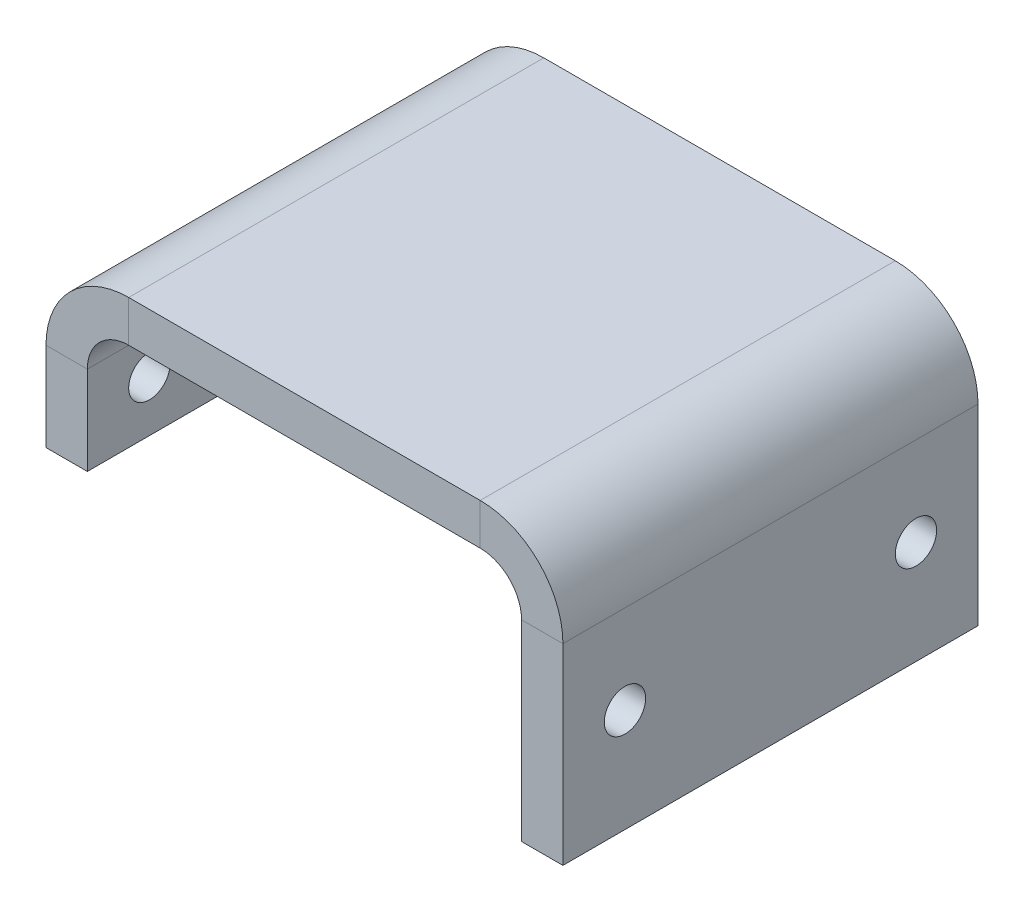
ISO-10303-21;
HEADER;
FILE_DESCRIPTION(('STEP AP214'),'2;1');
FILE_NAME('part.step','',(''),(''),'','','');
FILE_SCHEMA(('AUTOMOTIVE_DESIGN { 1 0 10303 214 1 1 1 1 }'));
ENDSEC;
DATA;
#1=APPLICATION_CONTEXT('core data for automotive mechanical design processes');
#2=APPLICATION_PROTOCOL_DEFINITION('international standard','automotive_design',2000,#1);
#3=PRODUCT_CONTEXT('',#1,'mechanical');
#4=PRODUCT('Part','Part','',(#3));
#5=PRODUCT_RELATED_PRODUCT_CATEGORY('part','',(#4));
#6=PRODUCT_DEFINITION_FORMATION('','',#4);
#7=PRODUCT_DEFINITION_CONTEXT('part definition',#1,'design');
#8=PRODUCT_DEFINITION('design','',#6,#7);
#9=PRODUCT_DEFINITION_SHAPE('','',#8);
#10=(LENGTH_UNIT() NAMED_UNIT(*) SI_UNIT(.MILLI.,.METRE.));
#11=(NAMED_UNIT(*) PLANE_ANGLE_UNIT() SI_UNIT($,.RADIAN.));
#12=(NAMED_UNIT(*) SI_UNIT($,.STERADIAN.) SOLID_ANGLE_UNIT());
#13=UNCERTAINTY_MEASURE_WITH_UNIT(LENGTH_MEASURE(1.E-05),#10,'distance_accuracy_value','');
#14=(GEOMETRIC_REPRESENTATION_CONTEXT(3) GLOBAL_UNCERTAINTY_ASSIGNED_CONTEXT((#13)) GLOBAL_UNIT_ASSIGNED_CONTEXT((#10,
#11,#12)) REPRESENTATION_CONTEXT('',''));
#15=CARTESIAN_POINT('',(0.,0.,0.));
#16=DIRECTION('',(0.,0.,1.));
#17=DIRECTION('',(1.,0.,0.));
#18=AXIS2_PLACEMENT_3D('',#15,#16,#17);
#19=CARTESIAN_POINT('',(-40.,-4.,20.075));
#20=DIRECTION('',(0.,0.,1.));
#21=DIRECTION('',(1.,0.,0.));
#22=AXIS2_PLACEMENT_3D('',#19,#20,#21);
#23=PLANE('',#22);
#24=DIRECTION('',(1.,0.,0.));
#25=VECTOR('',#24,1.);
#26=CARTESIAN_POINT('',(-40.,-4.,20.075));
#27=LINE('',#26,#25);
#28=CARTESIAN_POINT('',(-22.,-4.,20.075));
#29=VERTEX_POINT('',#28);
#30=CARTESIAN_POINT('',(12.,-4.,20.075));
#31=VERTEX_POINT('',#30);
#32=EDGE_CURVE('E219',#29,#31,#27,.T.);
#33=ORIENTED_EDGE('',*,*,#32,.T.);
#34=DIRECTION('',(0.,1.,0.));
#35=VECTOR('',#34,1.);
#36=CARTESIAN_POINT('',(12.,-4.,20.075));
#37=LINE('',#36,#35);
#38=CARTESIAN_POINT('',(12.,0.,20.075));
#39=VERTEX_POINT('',#38);
#40=EDGE_CURVE('E12',#31,#39,#37,.T.);
#41=ORIENTED_EDGE('',*,*,#40,.T.);
#42=DIRECTION('',(1.,0.,0.));
#43=VECTOR('',#42,1.);
#44=CARTESIAN_POINT('',(-40.,0.,20.075));
#45=LINE('',#44,#43);
#46=CARTESIAN_POINT('',(-22.,0.,20.075));
#47=VERTEX_POINT('',#46);
#48=EDGE_CURVE('E203',#47,#39,#45,.T.);
#49=ORIENTED_EDGE('',*,*,#48,.F.);
#50=DIRECTION('',(0.,1.,0.));
#51=VECTOR('',#50,1.);
#52=CARTESIAN_POINT('',(-22.,-4.,20.075));
#53=LINE('',#52,#51);
#54=EDGE_CURVE('E208',#29,#47,#53,.T.);
#55=ORIENTED_EDGE('',*,*,#54,.F.);
#56=EDGE_LOOP('',(#33,#41,#49,#55));
#57=FACE_BOUND('',#56,.T.);
#58=ADVANCED_FACE('F45',(#57),#23,.T.);
#59=CARTESIAN_POINT('',(-40.,-4.,-20.075));
#60=DIRECTION('',(0.,0.,-1.));
#61=DIRECTION('',(-1.,0.,0.));
#62=AXIS2_PLACEMENT_3D('',#59,#60,#61);
#63=PLANE('',#62);
#64=DIRECTION('',(-1.,0.,0.));
#65=VECTOR('',#64,1.);
#66=CARTESIAN_POINT('',(-40.,0.,-20.075));
#67=LINE('',#66,#65);
#68=CARTESIAN_POINT('',(12.,0.,-20.075));
#69=VERTEX_POINT('',#68);
#70=CARTESIAN_POINT('',(-22.,0.,-20.075));
#71=VERTEX_POINT('',#70);
#72=EDGE_CURVE('E204',#69,#71,#67,.T.);
#73=ORIENTED_EDGE('',*,*,#72,.F.);
#74=DIRECTION('',(0.,-1.,0.));
#75=VECTOR('',#74,1.);
#76=CARTESIAN_POINT('',(12.,-4.,-20.075));
#77=LINE('',#76,#75);
#78=CARTESIAN_POINT('',(12.,-4.,-20.075));
#79=VERTEX_POINT('',#78);
#80=EDGE_CURVE('E260',#69,#79,#77,.T.);
#81=ORIENTED_EDGE('',*,*,#80,.T.);
#82=DIRECTION('',(-1.,0.,0.));
#83=VECTOR('',#82,1.);
#84=CARTESIAN_POINT('',(-40.,-4.,-20.075));
#85=LINE('',#84,#83);
#86=CARTESIAN_POINT('',(-22.,-4.,-20.075));
#87=VERTEX_POINT('',#86);
#88=EDGE_CURVE('E48',#79,#87,#85,.T.);
#89=ORIENTED_EDGE('',*,*,#88,.T.);
#90=DIRECTION('',(0.,-1.,0.));
#91=VECTOR('',#90,1.);
#92=CARTESIAN_POINT('',(-22.,-4.,-20.075));
#93=LINE('',#92,#91);
#94=EDGE_CURVE('E205',#71,#87,#93,.T.);
#95=ORIENTED_EDGE('',*,*,#94,.F.);
#96=EDGE_LOOP('',(#73,#81,#89,#95));
#97=FACE_BOUND('',#96,.T.);
#98=ADVANCED_FACE('F273',(#97),#63,.T.);
#99=CARTESIAN_POINT('',(0.,-4.,0.));
#100=DIRECTION('',(0.,-1.,0.));
#101=DIRECTION('',(0.,0.,-1.));
#102=AXIS2_PLACEMENT_3D('',#99,#100,#101);
#103=PLANE('',#102);
#104=ORIENTED_EDGE('',*,*,#88,.F.);
#105=DIRECTION('',(0.,0.,1.));
#106=VECTOR('',#105,1.);
#107=CARTESIAN_POINT('',(12.,-4.,0.));
#108=LINE('',#107,#106);
#109=EDGE_CURVE('E251',#79,#31,#108,.T.);
#110=ORIENTED_EDGE('',*,*,#109,.T.);
#111=ORIENTED_EDGE('',*,*,#32,.F.);
#112=DIRECTION('',(0.,0.,1.));
#113=VECTOR('',#112,1.);
#114=CARTESIAN_POINT('',(-22.,-4.,0.));
#115=LINE('',#114,#113);
#116=EDGE_CURVE('E195',#87,#29,#115,.T.);
#117=ORIENTED_EDGE('',*,*,#116,.F.);
#118=EDGE_LOOP('',(#104,#110,#111,#117));
#119=FACE_BOUND('',#118,.T.);
#120=ADVANCED_FACE('F276',(#119),#103,.T.);
#121=CARTESIAN_POINT('',(-26.,-16.5752220392306,20.075));
#122=DIRECTION('',(0.,0.,1.));
#123=DIRECTION('',(0.,1.,0.));
#124=AXIS2_PLACEMENT_3D('',#121,#122,#123);
#125=PLANE('',#124);
#126=DIRECTION('',(0.,1.,0.));
#127=VECTOR('',#126,1.);
#128=CARTESIAN_POINT('',(-26.,-16.5752220392306,20.075));
#129=LINE('',#128,#127);
#130=CARTESIAN_POINT('',(-26.,-16.5752220392306,20.075));
#131=VERTEX_POINT('',#130);
#132=CARTESIAN_POINT('',(-26.,-8.00000000000001,20.075));
#133=VERTEX_POINT('',#132);
#134=EDGE_CURVE('E229',#131,#133,#129,.T.);
#135=ORIENTED_EDGE('',*,*,#134,.T.);
#136=DIRECTION('',(-1.,0.,0.));
#137=VECTOR('',#136,1.);
#138=CARTESIAN_POINT('',(-26.,-8.00000000000001,20.075));
#139=LINE('',#138,#137);
#140=CARTESIAN_POINT('',(-30.,-8.00000000000004,20.075));
#141=VERTEX_POINT('',#140);
#142=EDGE_CURVE('E248',#133,#141,#139,.T.);
#143=ORIENTED_EDGE('',*,*,#142,.T.);
#144=DIRECTION('',(0.,1.,0.));
#145=VECTOR('',#144,1.);
#146=CARTESIAN_POINT('',(-30.,-16.5752220392306,20.075));
#147=LINE('',#146,#145);
#148=CARTESIAN_POINT('',(-30.,-16.5752220392306,20.075));
#149=VERTEX_POINT('',#148);
#150=EDGE_CURVE('E234',#149,#141,#147,.T.);
#151=ORIENTED_EDGE('',*,*,#150,.F.);
#152=DIRECTION('',(-1.,0.,0.));
#153=VECTOR('',#152,1.);
#154=CARTESIAN_POINT('',(-26.,-16.5752220392306,20.075));
#155=LINE('',#154,#153);
#156=EDGE_CURVE('E235',#131,#149,#155,.T.);
#157=ORIENTED_EDGE('',*,*,#156,.F.);
#158=EDGE_LOOP('',(#135,#143,#151,#157));
#159=FACE_BOUND('',#158,.T.);
#160=ADVANCED_FACE('F289',(#159),#125,.T.);
#161=CARTESIAN_POINT('',(-26.,-16.5752220392306,-20.075));
#162=DIRECTION('',(0.,0.,-1.));
#163=DIRECTION('',(0.,-1.,0.));
#164=AXIS2_PLACEMENT_3D('',#161,#162,#163);
#165=PLANE('',#164);
#166=DIRECTION('',(0.,-1.,0.));
#167=VECTOR('',#166,1.);
#168=CARTESIAN_POINT('',(-30.,-16.5752220392306,-20.075));
#169=LINE('',#168,#167);
#170=CARTESIAN_POINT('',(-30.,-8.00000000000004,-20.075));
#171=VERTEX_POINT('',#170);
#172=CARTESIAN_POINT('',(-30.,-16.5752220392306,-20.075));
#173=VERTEX_POINT('',#172);
#174=EDGE_CURVE('E223',#171,#173,#169,.T.);
#175=ORIENTED_EDGE('',*,*,#174,.F.);
#176=DIRECTION('',(1.,0.,0.));
#177=VECTOR('',#176,1.);
#178=CARTESIAN_POINT('',(-26.,-8.00000000000001,-20.075));
#179=LINE('',#178,#177);
#180=CARTESIAN_POINT('',(-26.,-8.00000000000002,-20.075));
#181=VERTEX_POINT('',#180);
#182=EDGE_CURVE('E243',#171,#181,#179,.T.);
#183=ORIENTED_EDGE('',*,*,#182,.T.);
#184=DIRECTION('',(0.,-1.,0.));
#185=VECTOR('',#184,1.);
#186=CARTESIAN_POINT('',(-26.,-16.5752220392306,-20.075));
#187=LINE('',#186,#185);
#188=CARTESIAN_POINT('',(-26.,-16.5752220392306,-20.075));
#189=VERTEX_POINT('',#188);
#190=EDGE_CURVE('E230',#181,#189,#187,.T.);
#191=ORIENTED_EDGE('',*,*,#190,.T.);
#192=DIRECTION('',(-1.,0.,0.));
#193=VECTOR('',#192,1.);
#194=CARTESIAN_POINT('',(-26.,-16.5752220392306,-20.075));
#195=LINE('',#194,#193);
#196=EDGE_CURVE('E238',#189,#173,#195,.T.);
#197=ORIENTED_EDGE('',*,*,#196,.T.);
#198=EDGE_LOOP('',(#175,#183,#191,#197));
#199=FACE_BOUND('',#198,.T.);
#200=ADVANCED_FACE('F297',(#199),#165,.T.);
#201=CARTESIAN_POINT('',(-26.0000000000001,23.4247779607694,0.));
#202=DIRECTION('',(1.,0.,0.));
#203=DIRECTION('',(0.,0.,-1.));
#204=AXIS2_PLACEMENT_3D('',#201,#202,#203);
#205=PLANE('',#204);
#206=CARTESIAN_POINT('',(-26.,-11.5752220392306,-14.075));
#207=DIRECTION('',(-1.,0.,0.));
#208=DIRECTION('',(0.,0.,1.));
#209=AXIS2_PLACEMENT_3D('',#206,#207,#208);
#210=CIRCLE('',#209,2.);
#211=CARTESIAN_POINT('',(-26.,-11.5752220392306,-12.075));
#212=VERTEX_POINT('',#211);
#213=EDGE_CURVE('E220',#212,#212,#210,.T.);
#214=ORIENTED_EDGE('',*,*,#213,.T.);
#215=EDGE_LOOP('',(#214));
#216=FACE_BOUND('',#215,.T.);
#217=CARTESIAN_POINT('',(-26.,-11.5752220392306,14.075));
#218=DIRECTION('',(-1.,0.,0.));
#219=DIRECTION('',(0.,0.,-1.));
#220=AXIS2_PLACEMENT_3D('',#217,#218,#219);
#221=CIRCLE('',#220,2.);
#222=CARTESIAN_POINT('',(-26.,-11.5752220392306,12.075));
#223=VERTEX_POINT('',#222);
#224=EDGE_CURVE('E212',#223,#223,#221,.T.);
#225=ORIENTED_EDGE('',*,*,#224,.T.);
#226=EDGE_LOOP('',(#225));
#227=FACE_BOUND('',#226,.T.);
#228=ORIENTED_EDGE('',*,*,#190,.F.);
#229=DIRECTION('',(0.,0.,1.));
#230=VECTOR('',#229,1.);
#231=CARTESIAN_POINT('',(-26.,-8.00000000000001,0.));
#232=LINE('',#231,#230);
#233=EDGE_CURVE('E237',#181,#133,#232,.T.);
#234=ORIENTED_EDGE('',*,*,#233,.T.);
#235=ORIENTED_EDGE('',*,*,#134,.F.);
#236=DIRECTION('',(0.,0.,1.));
#237=VECTOR('',#236,1.);
#238=CARTESIAN_POINT('',(-26.,-16.5752220392306,20.075));
#239=LINE('',#238,#237);
#240=EDGE_CURVE('E226',#189,#131,#239,.T.);
#241=ORIENTED_EDGE('',*,*,#240,.F.);
#242=EDGE_LOOP('',(#228,#234,#235,#241));
#243=FACE_BOUND('',#242,.T.);
#244=ADVANCED_FACE('F286',(#216,#227,#243),#205,.T.);
#245=CARTESIAN_POINT('',(-26.,-16.5752220392306,20.075));
#246=DIRECTION('',(0.,-1.,0.));
#247=DIRECTION('',(0.,0.,1.));
#248=AXIS2_PLACEMENT_3D('',#245,#246,#247);
#249=PLANE('',#248);
#250=DIRECTION('',(0.,0.,1.));
#251=VECTOR('',#250,1.);
#252=CARTESIAN_POINT('',(-30.,-16.5752220392306,20.075));
#253=LINE('',#252,#251);
#254=EDGE_CURVE('E231',#173,#149,#253,.T.);
#255=ORIENTED_EDGE('',*,*,#254,.F.);
#256=ORIENTED_EDGE('',*,*,#196,.F.);
#257=ORIENTED_EDGE('',*,*,#240,.T.);
#258=ORIENTED_EDGE('',*,*,#156,.T.);
#259=EDGE_LOOP('',(#255,#256,#257,#258));
#260=FACE_BOUND('',#259,.T.);
#261=ADVANCED_FACE('F294',(#260),#249,.T.);
#262=CARTESIAN_POINT('',(-30.0000000000001,23.4247779607694,0.));
#263=DIRECTION('',(1.,0.,0.));
#264=DIRECTION('',(0.,0.,-1.));
#265=AXIS2_PLACEMENT_3D('',#262,#263,#264);
#266=PLANE('',#265);
#267=DIRECTION('',(0.,0.,1.));
#268=VECTOR('',#267,1.);
#269=CARTESIAN_POINT('',(-30.,-8.00000000000003,0.));
#270=LINE('',#269,#268);
#271=EDGE_CURVE('E246',#171,#141,#270,.T.);
#272=ORIENTED_EDGE('',*,*,#271,.F.);
#273=ORIENTED_EDGE('',*,*,#174,.T.);
#274=ORIENTED_EDGE('',*,*,#254,.T.);
#275=ORIENTED_EDGE('',*,*,#150,.T.);
#276=EDGE_LOOP('',(#272,#273,#274,#275));
#277=FACE_BOUND('',#276,.T.);
#278=CARTESIAN_POINT('',(-30.,-11.5752220392306,14.075));
#279=DIRECTION('',(-1.,0.,0.));
#280=DIRECTION('',(0.,0.,-1.));
#281=AXIS2_PLACEMENT_3D('',#278,#279,#280);
#282=CIRCLE('',#281,2.);
#283=CARTESIAN_POINT('',(-30.,-11.5752220392306,12.075));
#284=VERTEX_POINT('',#283);
#285=EDGE_CURVE('E216',#284,#284,#282,.T.);
#286=ORIENTED_EDGE('',*,*,#285,.F.);
#287=EDGE_LOOP('',(#286));
#288=FACE_BOUND('',#287,.T.);
#289=CARTESIAN_POINT('',(-30.,-11.5752220392306,-14.075));
#290=DIRECTION('',(-1.,0.,0.));
#291=DIRECTION('',(0.,0.,1.));
#292=AXIS2_PLACEMENT_3D('',#289,#290,#291);
#293=CIRCLE('',#292,2.);
#294=CARTESIAN_POINT('',(-30.,-11.5752220392306,-12.075));
#295=VERTEX_POINT('',#294);
#296=EDGE_CURVE('E215',#295,#295,#293,.T.);
#297=ORIENTED_EDGE('',*,*,#296,.F.);
#298=EDGE_LOOP('',(#297));
#299=FACE_BOUND('',#298,.T.);
#300=ADVANCED_FACE('F378',(#277,#288,#299),#266,.F.);
#301=CARTESIAN_POINT('',(-26.,-11.5752220392306,-14.075));
#302=DIRECTION('',(-1.,0.,0.));
#303=DIRECTION('',(0.,0.,1.));
#304=AXIS2_PLACEMENT_3D('',#301,#302,#303);
#305=CYLINDRICAL_SURFACE('',#304,2.);
#306=ORIENTED_EDGE('',*,*,#213,.F.);
#307=EDGE_LOOP('',(#306));
#308=FACE_BOUND('',#307,.T.);
#309=ORIENTED_EDGE('',*,*,#296,.T.);
#310=EDGE_LOOP('',(#309));
#311=FACE_BOUND('',#310,.T.);
#312=ADVANCED_FACE('F372',(#308,#311),#305,.F.);
#313=CARTESIAN_POINT('',(-26.,-11.5752220392306,14.075));
#314=DIRECTION('',(-1.,0.,0.));
#315=DIRECTION('',(0.,0.,1.));
#316=AXIS2_PLACEMENT_3D('',#313,#314,#315);
#317=CYLINDRICAL_SURFACE('',#316,2.);
#318=ORIENTED_EDGE('',*,*,#224,.F.);
#319=EDGE_LOOP('',(#318));
#320=FACE_BOUND('',#319,.T.);
#321=ORIENTED_EDGE('',*,*,#285,.T.);
#322=EDGE_LOOP('',(#321));
#323=FACE_BOUND('',#322,.T.);
#324=ADVANCED_FACE('F366',(#320,#323),#317,.F.);
#325=CARTESIAN_POINT('',(0.,0.,0.));
#326=DIRECTION('',(0.,-1.,0.));
#327=DIRECTION('',(0.,0.,-1.));
#328=AXIS2_PLACEMENT_3D('',#325,#326,#327);
#329=PLANE('',#328);
#330=DIRECTION('',(0.,0.,1.));
#331=VECTOR('',#330,1.);
#332=CARTESIAN_POINT('',(12.,0.,0.));
#333=LINE('',#332,#331);
#334=EDGE_CURVE('E53',#69,#39,#333,.T.);
#335=ORIENTED_EDGE('',*,*,#334,.F.);
#336=ORIENTED_EDGE('',*,*,#72,.T.);
#337=DIRECTION('',(0.,0.,1.));
#338=VECTOR('',#337,1.);
#339=CARTESIAN_POINT('',(-22.,0.,0.));
#340=LINE('',#339,#338);
#341=EDGE_CURVE('E200',#71,#47,#340,.T.);
#342=ORIENTED_EDGE('',*,*,#341,.T.);
#343=ORIENTED_EDGE('',*,*,#48,.T.);
#344=EDGE_LOOP('',(#335,#336,#342,#343));
#345=FACE_BOUND('',#344,.T.);
#346=ADVANCED_FACE('F302',(#345),#329,.F.);
#347=CARTESIAN_POINT('',(-22.,-8.,-20.075));
#348=DIRECTION('',(0.,0.,1.));
#349=DIRECTION('',(1.,0.,0.));
#350=AXIS2_PLACEMENT_3D('',#347,#348,#349);
#351=PLANE('',#350);
#352=ORIENTED_EDGE('',*,*,#182,.F.);
#353=CARTESIAN_POINT('',(-22.,-8.,-20.075));
#354=DIRECTION('',(0.,0.,-1.));
#355=DIRECTION('',(-1.,0.,0.));
#356=AXIS2_PLACEMENT_3D('',#353,#354,#355);
#357=CIRCLE('',#356,8.);
#358=EDGE_CURVE('E186',#171,#71,#357,.T.);
#359=ORIENTED_EDGE('',*,*,#358,.T.);
#360=ORIENTED_EDGE('',*,*,#94,.T.);
#361=CARTESIAN_POINT('',(-22.,-8.,-20.075));
#362=DIRECTION('',(0.,0.,-1.));
#363=DIRECTION('',(1.,0.,0.));
#364=AXIS2_PLACEMENT_3D('',#361,#362,#363);
#365=CIRCLE('',#364,4.);
#366=EDGE_CURVE('E190',#181,#87,#365,.T.);
#367=ORIENTED_EDGE('',*,*,#366,.F.);
#368=EDGE_LOOP('',(#352,#359,#360,#367));
#369=FACE_BOUND('',#368,.T.);
#370=ADVANCED_FACE('F280',(#369),#351,.F.);
#371=CARTESIAN_POINT('',(-22.,-8.,20.075));
#372=DIRECTION('',(0.,0.,-1.));
#373=DIRECTION('',(-1.,0.,0.));
#374=AXIS2_PLACEMENT_3D('',#371,#372,#373);
#375=PLANE('',#374);
#376=CARTESIAN_POINT('',(-22.,-8.,20.075));
#377=DIRECTION('',(0.,0.,-1.));
#378=DIRECTION('',(-1.,0.,0.));
#379=AXIS2_PLACEMENT_3D('',#376,#377,#378);
#380=CIRCLE('',#379,8.);
#381=EDGE_CURVE('E193',#47,#141,#380,.F.);
#382=ORIENTED_EDGE('',*,*,#381,.T.);
#383=ORIENTED_EDGE('',*,*,#142,.F.);
#384=CARTESIAN_POINT('',(-22.,-8.,20.075));
#385=DIRECTION('',(0.,0.,1.));
#386=DIRECTION('',(-1.,0.,0.));
#387=AXIS2_PLACEMENT_3D('',#384,#385,#386);
#388=CIRCLE('',#387,4.);
#389=EDGE_CURVE('E68',#29,#133,#388,.T.);
#390=ORIENTED_EDGE('',*,*,#389,.F.);
#391=ORIENTED_EDGE('',*,*,#54,.T.);
#392=EDGE_LOOP('',(#382,#383,#390,#391));
#393=FACE_BOUND('',#392,.T.);
#394=ADVANCED_FACE('F304',(#393),#375,.F.);
#395=CARTESIAN_POINT('',(-22.,-8.,41.4348758850537));
#396=DIRECTION('',(0.,0.,-1.));
#397=DIRECTION('',(-1.,0.,0.));
#398=AXIS2_PLACEMENT_3D('',#395,#396,#397);
#399=CYLINDRICAL_SURFACE('',#398,4.);
#400=ORIENTED_EDGE('',*,*,#116,.T.);
#401=ORIENTED_EDGE('',*,*,#389,.T.);
#402=ORIENTED_EDGE('',*,*,#233,.F.);
#403=ORIENTED_EDGE('',*,*,#366,.T.);
#404=EDGE_LOOP('',(#400,#401,#402,#403));
#405=FACE_BOUND('',#404,.T.);
#406=ADVANCED_FACE('F283',(#405),#399,.F.);
#407=CARTESIAN_POINT('',(-22.,-8.,41.4348758850537));
#408=DIRECTION('',(0.,0.,-1.));
#409=DIRECTION('',(-1.,0.,0.));
#410=AXIS2_PLACEMENT_3D('',#407,#408,#409);
#411=CYLINDRICAL_SURFACE('',#410,8.);
#412=ORIENTED_EDGE('',*,*,#341,.F.);
#413=ORIENTED_EDGE('',*,*,#358,.F.);
#414=ORIENTED_EDGE('',*,*,#271,.T.);
#415=ORIENTED_EDGE('',*,*,#381,.F.);
#416=EDGE_LOOP('',(#412,#413,#414,#415));
#417=FACE_BOUND('',#416,.T.);
#418=ADVANCED_FACE('F300',(#417),#411,.T.);
#419=CARTESIAN_POINT('',(12.,-8.,-20.075));
#420=DIRECTION('',(0.,0.,1.));
#421=DIRECTION('',(1.,0.,0.));
#422=AXIS2_PLACEMENT_3D('',#419,#420,#421);
#423=PLANE('',#422);
#424=ORIENTED_EDGE('',*,*,#80,.F.);
#425=CARTESIAN_POINT('',(12.,-8.,-20.075));
#426=DIRECTION('',(0.,0.,1.));
#427=DIRECTION('',(1.,0.,0.));
#428=AXIS2_PLACEMENT_3D('',#425,#426,#427);
#429=CIRCLE('',#428,8.);
#430=CARTESIAN_POINT('',(20.,-8.00000000000004,-20.075));
#431=VERTEX_POINT('',#430);
#432=EDGE_CURVE('E154',#69,#431,#429,.F.);
#433=ORIENTED_EDGE('',*,*,#432,.T.);
#434=DIRECTION('',(-1.,0.,0.));
#435=VECTOR('',#434,1.);
#436=CARTESIAN_POINT('',(16.,-8.00000000000002,-20.075));
#437=LINE('',#436,#435);
#438=CARTESIAN_POINT('',(16.,-8.00000000000002,-20.075));
#439=VERTEX_POINT('',#438);
#440=EDGE_CURVE('E173',#431,#439,#437,.T.);
#441=ORIENTED_EDGE('',*,*,#440,.T.);
#442=CARTESIAN_POINT('',(12.,-8.,-20.075));
#443=DIRECTION('',(0.,0.,-1.));
#444=DIRECTION('',(1.,0.,0.));
#445=AXIS2_PLACEMENT_3D('',#442,#443,#444);
#446=CIRCLE('',#445,4.);
#447=EDGE_CURVE('E179',#79,#439,#446,.T.);
#448=ORIENTED_EDGE('',*,*,#447,.F.);
#449=EDGE_LOOP('',(#424,#433,#441,#448));
#450=FACE_BOUND('',#449,.T.);
#451=ADVANCED_FACE('F321',(#450),#423,.F.);
#452=CARTESIAN_POINT('',(12.,-8.,20.075));
#453=DIRECTION('',(0.,0.,-1.));
#454=DIRECTION('',(-1.,0.,0.));
#455=AXIS2_PLACEMENT_3D('',#452,#453,#454);
#456=PLANE('',#455);
#457=DIRECTION('',(1.,0.,0.));
#458=VECTOR('',#457,1.);
#459=CARTESIAN_POINT('',(16.,-8.00000000000001,20.075));
#460=LINE('',#459,#458);
#461=CARTESIAN_POINT('',(16.,-8.00000000000001,20.075));
#462=VERTEX_POINT('',#461);
#463=CARTESIAN_POINT('',(20.,-8.00000000000003,20.075));
#464=VERTEX_POINT('',#463);
#465=EDGE_CURVE('E143',#462,#464,#460,.T.);
#466=ORIENTED_EDGE('',*,*,#465,.T.);
#467=CARTESIAN_POINT('',(12.,-8.,20.075));
#468=DIRECTION('',(0.,0.,1.));
#469=DIRECTION('',(1.,0.,0.));
#470=AXIS2_PLACEMENT_3D('',#467,#468,#469);
#471=CIRCLE('',#470,8.);
#472=EDGE_CURVE('E183',#464,#39,#471,.T.);
#473=ORIENTED_EDGE('',*,*,#472,.T.);
#474=ORIENTED_EDGE('',*,*,#40,.F.);
#475=CARTESIAN_POINT('',(12.,-8.,20.075));
#476=DIRECTION('',(0.,0.,1.));
#477=DIRECTION('',(-1.,0.,0.));
#478=AXIS2_PLACEMENT_3D('',#475,#476,#477);
#479=CIRCLE('',#478,4.);
#480=EDGE_CURVE('E182',#462,#31,#479,.T.);
#481=ORIENTED_EDGE('',*,*,#480,.F.);
#482=EDGE_LOOP('',(#466,#473,#474,#481));
#483=FACE_BOUND('',#482,.T.);
#484=ADVANCED_FACE('F308',(#483),#456,.F.);
#485=CARTESIAN_POINT('',(12.,-8.,-41.4348758850537));
#486=DIRECTION('',(0.,0.,1.));
#487=DIRECTION('',(1.,0.,0.));
#488=AXIS2_PLACEMENT_3D('',#485,#486,#487);
#489=CYLINDRICAL_SURFACE('',#488,4.);
#490=ORIENTED_EDGE('',*,*,#480,.T.);
#491=ORIENTED_EDGE('',*,*,#109,.F.);
#492=ORIENTED_EDGE('',*,*,#447,.T.);
#493=DIRECTION('',(0.,0.,1.));
#494=VECTOR('',#493,1.);
#495=CARTESIAN_POINT('',(16.,-8.00000000000002,0.));
#496=LINE('',#495,#494);
#497=EDGE_CURVE('E177',#439,#462,#496,.T.);
#498=ORIENTED_EDGE('',*,*,#497,.T.);
#499=EDGE_LOOP('',(#490,#491,#492,#498));
#500=FACE_BOUND('',#499,.T.);
#501=ADVANCED_FACE('F311',(#500),#489,.F.);
#502=CARTESIAN_POINT('',(12.,-8.,-41.4348758850537));
#503=DIRECTION('',(0.,0.,1.));
#504=DIRECTION('',(1.,0.,0.));
#505=AXIS2_PLACEMENT_3D('',#502,#503,#504);
#506=CYLINDRICAL_SURFACE('',#505,8.);
#507=ORIENTED_EDGE('',*,*,#472,.F.);
#508=DIRECTION('',(0.,0.,1.));
#509=VECTOR('',#508,1.);
#510=CARTESIAN_POINT('',(20.,-8.00000000000004,0.));
#511=LINE('',#510,#509);
#512=EDGE_CURVE('E324',#431,#464,#511,.T.);
#513=ORIENTED_EDGE('',*,*,#512,.F.);
#514=ORIENTED_EDGE('',*,*,#432,.F.);
#515=ORIENTED_EDGE('',*,*,#334,.T.);
#516=EDGE_LOOP('',(#507,#513,#514,#515));
#517=FACE_BOUND('',#516,.T.);
#518=ADVANCED_FACE('F322',(#517),#506,.T.);
#519=CARTESIAN_POINT('',(16.,-16.5752220392306,-14.075));
#520=DIRECTION('',(1.,0.,0.));
#521=DIRECTION('',(0.,0.,1.));
#522=AXIS2_PLACEMENT_3D('',#519,#520,#521);
#523=CYLINDRICAL_SURFACE('',#522,2.);
#524=CARTESIAN_POINT('',(16.,-16.5752220392306,-14.075));
#525=DIRECTION('',(1.,0.,0.));
#526=DIRECTION('',(0.,0.,1.));
#527=AXIS2_PLACEMENT_3D('',#524,#525,#526);
#528=CIRCLE('',#527,2.);
#529=CARTESIAN_POINT('',(16.,-16.5752220392306,-12.075));
#530=VERTEX_POINT('',#529);
#531=EDGE_CURVE('E318',#530,#530,#528,.T.);
#532=ORIENTED_EDGE('',*,*,#531,.F.);
#533=EDGE_LOOP('',(#532));
#534=FACE_BOUND('',#533,.T.);
#535=CARTESIAN_POINT('',(20.,-16.5752220392306,-14.075));
#536=DIRECTION('',(1.,0.,0.));
#537=DIRECTION('',(0.,0.,1.));
#538=AXIS2_PLACEMENT_3D('',#535,#536,#537);
#539=CIRCLE('',#538,2.);
#540=CARTESIAN_POINT('',(20.,-16.5752220392306,-12.075));
#541=VERTEX_POINT('',#540);
#542=EDGE_CURVE('E167',#541,#541,#539,.T.);
#543=ORIENTED_EDGE('',*,*,#542,.T.);
#544=EDGE_LOOP('',(#543));
#545=FACE_BOUND('',#544,.T.);
#546=ADVANCED_FACE('F340',(#534,#545),#523,.F.);
#547=CARTESIAN_POINT('',(16.,-16.5752220392306,14.075));
#548=DIRECTION('',(1.,0.,0.));
#549=DIRECTION('',(0.,0.,1.));
#550=AXIS2_PLACEMENT_3D('',#547,#548,#549);
#551=CYLINDRICAL_SURFACE('',#550,2.);
#552=CARTESIAN_POINT('',(16.,-16.5752220392306,14.075));
#553=DIRECTION('',(1.,0.,0.));
#554=DIRECTION('',(0.,0.,-1.));
#555=AXIS2_PLACEMENT_3D('',#552,#553,#554);
#556=CIRCLE('',#555,2.);
#557=CARTESIAN_POINT('',(16.,-16.5752220392306,12.075));
#558=VERTEX_POINT('',#557);
#559=EDGE_CURVE('E164',#558,#558,#556,.T.);
#560=ORIENTED_EDGE('',*,*,#559,.F.);
#561=EDGE_LOOP('',(#560));
#562=FACE_BOUND('',#561,.T.);
#563=CARTESIAN_POINT('',(20.,-16.5752220392306,14.075));
#564=DIRECTION('',(1.,0.,0.));
#565=DIRECTION('',(0.,0.,-1.));
#566=AXIS2_PLACEMENT_3D('',#563,#564,#565);
#567=CIRCLE('',#566,2.);
#568=CARTESIAN_POINT('',(20.,-16.5752220392306,12.075));
#569=VERTEX_POINT('',#568);
#570=EDGE_CURVE('E162',#569,#569,#567,.T.);
#571=ORIENTED_EDGE('',*,*,#570,.T.);
#572=EDGE_LOOP('',(#571));
#573=FACE_BOUND('',#572,.T.);
#574=ADVANCED_FACE('F337',(#562,#573),#551,.F.);
#575=CARTESIAN_POINT('',(16.,-26.5752220392306,20.075));
#576=DIRECTION('',(0.,-1.,0.));
#577=DIRECTION('',(0.,0.,-1.));
#578=AXIS2_PLACEMENT_3D('',#575,#576,#577);
#579=PLANE('',#578);
#580=DIRECTION('',(0.,0.,-1.));
#581=VECTOR('',#580,1.);
#582=CARTESIAN_POINT('',(20.,-26.5752220392306,20.075));
#583=LINE('',#582,#581);
#584=CARTESIAN_POINT('',(20.,-26.5752220392306,20.075));
#585=VERTEX_POINT('',#584);
#586=CARTESIAN_POINT('',(20.,-26.5752220392306,-20.075));
#587=VERTEX_POINT('',#586);
#588=EDGE_CURVE('E147',#585,#587,#583,.T.);
#589=ORIENTED_EDGE('',*,*,#588,.F.);
#590=DIRECTION('',(1.,0.,0.));
#591=VECTOR('',#590,1.);
#592=CARTESIAN_POINT('',(16.,-26.5752220392306,20.075));
#593=LINE('',#592,#591);
#594=CARTESIAN_POINT('',(16.,-26.5752220392306,20.075));
#595=VERTEX_POINT('',#594);
#596=EDGE_CURVE('E140',#595,#585,#593,.T.);
#597=ORIENTED_EDGE('',*,*,#596,.F.);
#598=DIRECTION('',(0.,0.,-1.));
#599=VECTOR('',#598,1.);
#600=CARTESIAN_POINT('',(16.,-26.5752220392306,20.075));
#601=LINE('',#600,#599);
#602=CARTESIAN_POINT('',(16.,-26.5752220392306,-20.075));
#603=VERTEX_POINT('',#602);
#604=EDGE_CURVE('E152',#595,#603,#601,.T.);
#605=ORIENTED_EDGE('',*,*,#604,.T.);
#606=DIRECTION('',(1.,0.,0.));
#607=VECTOR('',#606,1.);
#608=CARTESIAN_POINT('',(16.,-26.5752220392306,-20.075));
#609=LINE('',#608,#607);
#610=EDGE_CURVE('E161',#603,#587,#609,.T.);
#611=ORIENTED_EDGE('',*,*,#610,.T.);
#612=EDGE_LOOP('',(#589,#597,#605,#611));
#613=FACE_BOUND('',#612,.T.);
#614=ADVANCED_FACE('F151',(#613),#579,.T.);
#615=CARTESIAN_POINT('',(16.0000000000001,13.4247779607694,0.));
#616=DIRECTION('',(-1.,0.,0.));
#617=DIRECTION('',(0.,0.,-1.));
#618=AXIS2_PLACEMENT_3D('',#615,#616,#617);
#619=PLANE('',#618);
#620=ORIENTED_EDGE('',*,*,#497,.F.);
#621=DIRECTION('',(0.,1.,0.));
#622=VECTOR('',#621,1.);
#623=CARTESIAN_POINT('',(16.0000000000002,53.4247779607694,-20.075));
#624=LINE('',#623,#622);
#625=EDGE_CURVE('E160',#603,#439,#624,.T.);
#626=ORIENTED_EDGE('',*,*,#625,.F.);
#627=ORIENTED_EDGE('',*,*,#604,.F.);
#628=DIRECTION('',(0.,-1.,0.));
#629=VECTOR('',#628,1.);
#630=CARTESIAN_POINT('',(16.0000000000002,53.4247779607694,20.075));
#631=LINE('',#630,#629);
#632=EDGE_CURVE('E137',#462,#595,#631,.T.);
#633=ORIENTED_EDGE('',*,*,#632,.F.);
#634=EDGE_LOOP('',(#620,#626,#627,#633));
#635=FACE_BOUND('',#634,.T.);
#636=ORIENTED_EDGE('',*,*,#559,.T.);
#637=EDGE_LOOP('',(#636));
#638=FACE_BOUND('',#637,.T.);
#639=ORIENTED_EDGE('',*,*,#531,.T.);
#640=EDGE_LOOP('',(#639));
#641=FACE_BOUND('',#640,.T.);
#642=ADVANCED_FACE('F157',(#635,#638,#641),#619,.T.);
#643=CARTESIAN_POINT('',(16.0000000000002,53.4247779607694,-20.075));
#644=DIRECTION('',(0.,0.,-1.));
#645=DIRECTION('',(0.,1.,0.));
#646=AXIS2_PLACEMENT_3D('',#643,#644,#645);
#647=PLANE('',#646);
#648=ORIENTED_EDGE('',*,*,#440,.F.);
#649=DIRECTION('',(0.,1.,0.));
#650=VECTOR('',#649,1.);
#651=CARTESIAN_POINT('',(20.0000000000002,53.4247779607694,-20.075));
#652=LINE('',#651,#650);
#653=EDGE_CURVE('E317',#587,#431,#652,.T.);
#654=ORIENTED_EDGE('',*,*,#653,.F.);
#655=ORIENTED_EDGE('',*,*,#610,.F.);
#656=ORIENTED_EDGE('',*,*,#625,.T.);
#657=EDGE_LOOP('',(#648,#654,#655,#656));
#658=FACE_BOUND('',#657,.T.);
#659=ADVANCED_FACE('F314',(#658),#647,.T.);
#660=CARTESIAN_POINT('',(20.0000000000001,13.4247779607694,0.));
#661=DIRECTION('',(-1.,0.,0.));
#662=DIRECTION('',(0.,0.,-1.));
#663=AXIS2_PLACEMENT_3D('',#660,#661,#662);
#664=PLANE('',#663);
#665=ORIENTED_EDGE('',*,*,#542,.F.);
#666=EDGE_LOOP('',(#665));
#667=FACE_BOUND('',#666,.T.);
#668=ORIENTED_EDGE('',*,*,#570,.F.);
#669=EDGE_LOOP('',(#668));
#670=FACE_BOUND('',#669,.T.);
#671=ORIENTED_EDGE('',*,*,#653,.T.);
#672=ORIENTED_EDGE('',*,*,#512,.T.);
#673=DIRECTION('',(0.,-1.,0.));
#674=VECTOR('',#673,1.);
#675=CARTESIAN_POINT('',(20.0000000000002,53.4247779607694,20.075));
#676=LINE('',#675,#674);
#677=EDGE_CURVE('E326',#464,#585,#676,.T.);
#678=ORIENTED_EDGE('',*,*,#677,.T.);
#679=ORIENTED_EDGE('',*,*,#588,.T.);
#680=EDGE_LOOP('',(#671,#672,#678,#679));
#681=FACE_BOUND('',#680,.T.);
#682=ADVANCED_FACE('F344',(#667,#670,#681),#664,.F.);
#683=CARTESIAN_POINT('',(16.0000000000002,53.4247779607694,20.075));
#684=DIRECTION('',(0.,0.,1.));
#685=DIRECTION('',(0.,-1.,0.));
#686=AXIS2_PLACEMENT_3D('',#683,#684,#685);
#687=PLANE('',#686);
#688=ORIENTED_EDGE('',*,*,#465,.F.);
#689=ORIENTED_EDGE('',*,*,#632,.T.);
#690=ORIENTED_EDGE('',*,*,#596,.T.);
#691=ORIENTED_EDGE('',*,*,#677,.F.);
#692=EDGE_LOOP('',(#688,#689,#690,#691));
#693=FACE_BOUND('',#692,.T.);
#694=ADVANCED_FACE('F139',(#693),#687,.T.);
#695=CLOSED_SHELL('',(#58,#98,#120,#160,#200,#244,#261,#300,#312,#324,#346,#370,#394,#406,#418,
#451,#484,#501,#518,#546,#574,#614,#642,#659,#682,#694));
#696=MANIFOLD_SOLID_BREP('B2',#695);
#697=ADVANCED_BREP_SHAPE_REPRESENTATION('',(#18,#696),#14);
#698=SHAPE_DEFINITION_REPRESENTATION(#9,#697);
ENDSEC;
END-ISO-10303-21;
